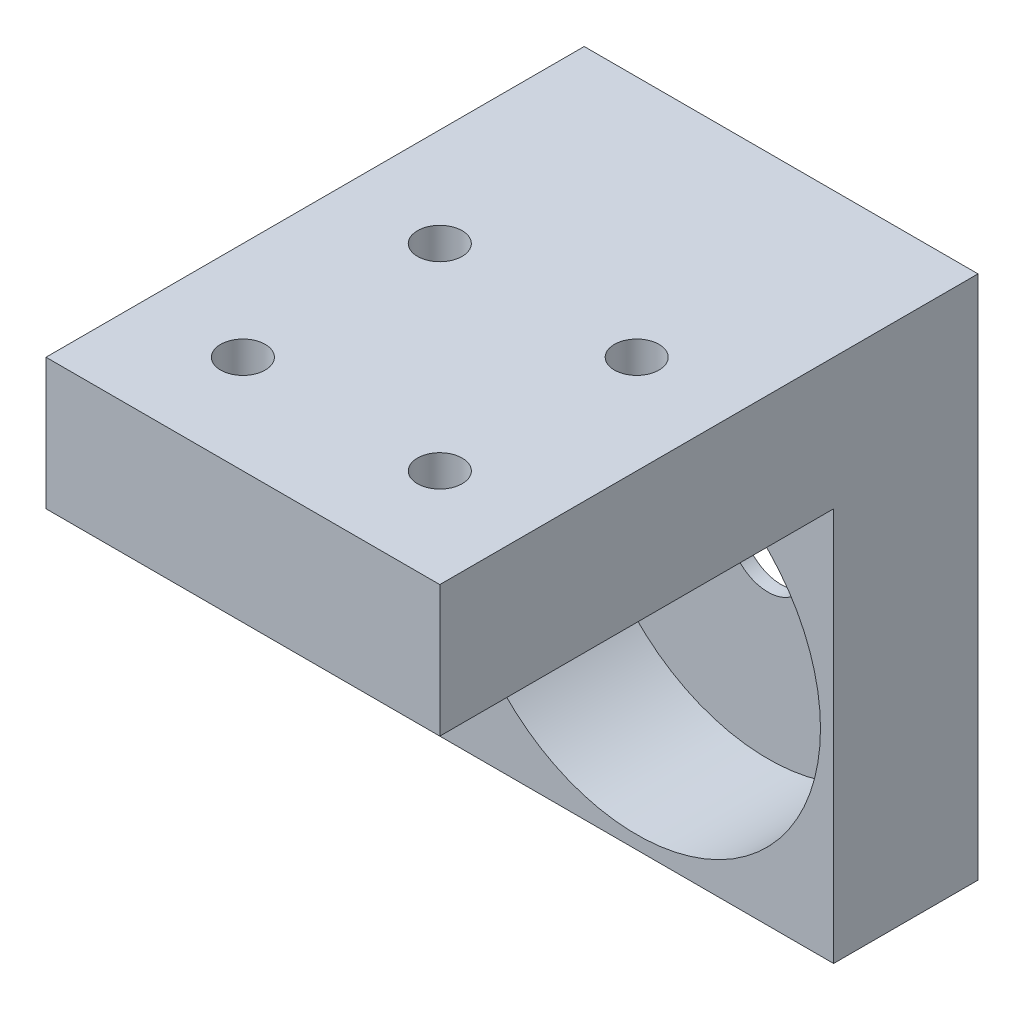
ISO-10303-21;
HEADER;
FILE_DESCRIPTION(('STEP AP214'),'2;1');
FILE_NAME('part.step','',(''),(''),'','','');
FILE_SCHEMA(('AUTOMOTIVE_DESIGN { 1 0 10303 214 1 1 1 1 }'));
ENDSEC;
DATA;
#1=APPLICATION_CONTEXT('core data for automotive mechanical design processes');
#2=APPLICATION_PROTOCOL_DEFINITION('international standard','automotive_design',2000,#1);
#3=PRODUCT_CONTEXT('',#1,'mechanical');
#4=PRODUCT('Part','Part','',(#3));
#5=PRODUCT_RELATED_PRODUCT_CATEGORY('part','',(#4));
#6=PRODUCT_DEFINITION_FORMATION('','',#4);
#7=PRODUCT_DEFINITION_CONTEXT('part definition',#1,'design');
#8=PRODUCT_DEFINITION('design','',#6,#7);
#9=PRODUCT_DEFINITION_SHAPE('','',#8);
#10=(LENGTH_UNIT() NAMED_UNIT(*) SI_UNIT(.MILLI.,.METRE.));
#11=(NAMED_UNIT(*) PLANE_ANGLE_UNIT() SI_UNIT($,.RADIAN.));
#12=(NAMED_UNIT(*) SI_UNIT($,.STERADIAN.) SOLID_ANGLE_UNIT());
#13=UNCERTAINTY_MEASURE_WITH_UNIT(LENGTH_MEASURE(1.E-05),#10,'distance_accuracy_value','');
#14=(GEOMETRIC_REPRESENTATION_CONTEXT(3) GLOBAL_UNCERTAINTY_ASSIGNED_CONTEXT((#13)) GLOBAL_UNIT_ASSIGNED_CONTEXT((#10,
#11,#12)) REPRESENTATION_CONTEXT('',''));
#15=CARTESIAN_POINT('',(0.,0.,0.));
#16=DIRECTION('',(0.,0.,1.));
#17=DIRECTION('',(1.,0.,0.));
#18=AXIS2_PLACEMENT_3D('',#15,#16,#17);
#19=CARTESIAN_POINT('',(0.,0.,11.));
#20=DIRECTION('',(1.,0.,0.));
#21=DIRECTION('',(0.,0.,-1.));
#22=AXIS2_PLACEMENT_3D('',#19,#20,#21);
#23=PLANE('',#22);
#24=DIRECTION('',(0.,-1.,0.));
#25=VECTOR('',#24,1.);
#26=CARTESIAN_POINT('',(0.,0.,0.));
#27=LINE('',#26,#25);
#28=CARTESIAN_POINT('',(0.,40.,0.));
#29=VERTEX_POINT('',#28);
#30=CARTESIAN_POINT('',(0.,0.,0.));
#31=VERTEX_POINT('',#30);
#32=EDGE_CURVE('E224',#29,#31,#27,.T.);
#33=ORIENTED_EDGE('',*,*,#32,.T.);
#34=DIRECTION('',(0.,0.,-1.));
#35=VECTOR('',#34,1.);
#36=CARTESIAN_POINT('',(0.,0.,11.));
#37=LINE('',#36,#35);
#38=CARTESIAN_POINT('',(0.,0.,11.));
#39=VERTEX_POINT('',#38);
#40=EDGE_CURVE('E14',#39,#31,#37,.T.);
#41=ORIENTED_EDGE('',*,*,#40,.F.);
#42=DIRECTION('',(0.,-1.,0.));
#43=VECTOR('',#42,1.);
#44=CARTESIAN_POINT('',(0.,0.,11.));
#45=LINE('',#44,#43);
#46=CARTESIAN_POINT('',(0.,30.,11.));
#47=VERTEX_POINT('',#46);
#48=EDGE_CURVE('E212',#47,#39,#45,.T.);
#49=ORIENTED_EDGE('',*,*,#48,.F.);
#50=DIRECTION('',(0.,0.,1.));
#51=VECTOR('',#50,1.);
#52=CARTESIAN_POINT('',(0.,30.,0.));
#53=LINE('',#52,#51);
#54=CARTESIAN_POINT('',(0.,30.,41.));
#55=VERTEX_POINT('',#54);
#56=EDGE_CURVE('E176',#47,#55,#53,.T.);
#57=ORIENTED_EDGE('',*,*,#56,.T.);
#58=DIRECTION('',(0.,-1.,0.));
#59=VECTOR('',#58,1.);
#60=CARTESIAN_POINT('',(0.,40.,41.));
#61=LINE('',#60,#59);
#62=CARTESIAN_POINT('',(0.,40.,41.));
#63=VERTEX_POINT('',#62);
#64=EDGE_CURVE('E257',#63,#55,#61,.T.);
#65=ORIENTED_EDGE('',*,*,#64,.F.);
#66=DIRECTION('',(0.,0.,1.));
#67=VECTOR('',#66,1.);
#68=CARTESIAN_POINT('',(0.,40.,0.));
#69=LINE('',#68,#67);
#70=EDGE_CURVE('E228',#29,#63,#69,.T.);
#71=ORIENTED_EDGE('',*,*,#70,.F.);
#72=EDGE_LOOP('',(#33,#41,#49,#57,#65,#71));
#73=FACE_BOUND('',#72,.T.);
#74=ADVANCED_FACE('F157',(#73),#23,.F.);
#75=CARTESIAN_POINT('',(0.,0.,11.));
#76=DIRECTION('',(0.,1.,0.));
#77=DIRECTION('',(0.,0.,1.));
#78=AXIS2_PLACEMENT_3D('',#75,#76,#77);
#79=PLANE('',#78);
#80=DIRECTION('',(1.,0.,0.));
#81=VECTOR('',#80,1.);
#82=CARTESIAN_POINT('',(0.,0.,0.));
#83=LINE('',#82,#81);
#84=CARTESIAN_POINT('',(30.,0.,0.));
#85=VERTEX_POINT('',#84);
#86=EDGE_CURVE('E190',#31,#85,#83,.T.);
#87=ORIENTED_EDGE('',*,*,#86,.T.);
#88=DIRECTION('',(0.,0.,-1.));
#89=VECTOR('',#88,1.);
#90=CARTESIAN_POINT('',(30.,0.,11.));
#91=LINE('',#90,#89);
#92=CARTESIAN_POINT('',(30.,0.,11.));
#93=VERTEX_POINT('',#92);
#94=EDGE_CURVE('E169',#93,#85,#91,.T.);
#95=ORIENTED_EDGE('',*,*,#94,.F.);
#96=DIRECTION('',(1.,0.,0.));
#97=VECTOR('',#96,1.);
#98=CARTESIAN_POINT('',(0.,0.,11.));
#99=LINE('',#98,#97);
#100=EDGE_CURVE('E201',#39,#93,#99,.T.);
#101=ORIENTED_EDGE('',*,*,#100,.F.);
#102=ORIENTED_EDGE('',*,*,#40,.T.);
#103=EDGE_LOOP('',(#87,#95,#101,#102));
#104=FACE_BOUND('',#103,.T.);
#105=ADVANCED_FACE('F202',(#104),#79,.F.);
#106=CARTESIAN_POINT('',(30.,0.,11.));
#107=DIRECTION('',(-1.,0.,0.));
#108=DIRECTION('',(0.,0.,1.));
#109=AXIS2_PLACEMENT_3D('',#106,#107,#108);
#110=PLANE('',#109);
#111=DIRECTION('',(0.,1.,0.));
#112=VECTOR('',#111,1.);
#113=CARTESIAN_POINT('',(30.,0.,0.));
#114=LINE('',#113,#112);
#115=CARTESIAN_POINT('',(30.,40.,0.));
#116=VERTEX_POINT('',#115);
#117=EDGE_CURVE('E219',#85,#116,#114,.T.);
#118=ORIENTED_EDGE('',*,*,#117,.T.);
#119=DIRECTION('',(0.,0.,-1.));
#120=VECTOR('',#119,1.);
#121=CARTESIAN_POINT('',(30.,40.,0.));
#122=LINE('',#121,#120);
#123=CARTESIAN_POINT('',(30.,40.,41.));
#124=VERTEX_POINT('',#123);
#125=EDGE_CURVE('E285',#124,#116,#122,.T.);
#126=ORIENTED_EDGE('',*,*,#125,.F.);
#127=DIRECTION('',(0.,-1.,0.));
#128=VECTOR('',#127,1.);
#129=CARTESIAN_POINT('',(30.,40.,41.));
#130=LINE('',#129,#128);
#131=CARTESIAN_POINT('',(30.,30.,41.));
#132=VERTEX_POINT('',#131);
#133=EDGE_CURVE('E270',#124,#132,#130,.T.);
#134=ORIENTED_EDGE('',*,*,#133,.T.);
#135=DIRECTION('',(0.,0.,-1.));
#136=VECTOR('',#135,1.);
#137=CARTESIAN_POINT('',(30.,30.,0.));
#138=LINE('',#137,#136);
#139=CARTESIAN_POINT('',(30.,30.,11.));
#140=VERTEX_POINT('',#139);
#141=EDGE_CURVE('E275',#132,#140,#138,.T.);
#142=ORIENTED_EDGE('',*,*,#141,.T.);
#143=DIRECTION('',(0.,1.,0.));
#144=VECTOR('',#143,1.);
#145=CARTESIAN_POINT('',(30.,0.,11.));
#146=LINE('',#145,#144);
#147=EDGE_CURVE('E213',#93,#140,#146,.T.);
#148=ORIENTED_EDGE('',*,*,#147,.F.);
#149=ORIENTED_EDGE('',*,*,#94,.T.);
#150=EDGE_LOOP('',(#118,#126,#134,#142,#148,#149));
#151=FACE_BOUND('',#150,.T.);
#152=ADVANCED_FACE('F356',(#151),#110,.F.);
#153=CARTESIAN_POINT('',(0.,0.,11.));
#154=DIRECTION('',(0.,0.,-1.));
#155=DIRECTION('',(-1.,0.,0.));
#156=AXIS2_PLACEMENT_3D('',#153,#154,#155);
#157=PLANE('',#156);
#158=CARTESIAN_POINT('',(15.,15.,11.));
#159=DIRECTION('',(0.,0.,1.));
#160=DIRECTION('',(1.,0.,0.));
#161=AXIS2_PLACEMENT_3D('',#158,#159,#160);
#162=CIRCLE('',#161,14.);
#163=CARTESIAN_POINT('',(29.,15.,11.));
#164=VERTEX_POINT('',#163);
#165=EDGE_CURVE('E240',#164,#164,#162,.T.);
#166=ORIENTED_EDGE('',*,*,#165,.F.);
#167=EDGE_LOOP('',(#166));
#168=FACE_BOUND('',#167,.T.);
#169=ORIENTED_EDGE('',*,*,#48,.T.);
#170=ORIENTED_EDGE('',*,*,#100,.T.);
#171=ORIENTED_EDGE('',*,*,#147,.T.);
#172=DIRECTION('',(-1.,0.,0.));
#173=VECTOR('',#172,1.);
#174=CARTESIAN_POINT('',(0.,30.,11.));
#175=LINE('',#174,#173);
#176=EDGE_CURVE('E192',#140,#47,#175,.T.);
#177=ORIENTED_EDGE('',*,*,#176,.T.);
#178=EDGE_LOOP('',(#169,#170,#171,#177));
#179=FACE_BOUND('',#178,.T.);
#180=ADVANCED_FACE('F220',(#168,#179),#157,.F.);
#181=CARTESIAN_POINT('',(0.,0.,0.));
#182=DIRECTION('',(0.,0.,-1.));
#183=DIRECTION('',(-1.,0.,0.));
#184=AXIS2_PLACEMENT_3D('',#181,#182,#183);
#185=PLANE('',#184);
#186=CARTESIAN_POINT('',(15.,15.,0.));
#187=DIRECTION('',(0.,0.,1.));
#188=DIRECTION('',(1.,0.,0.));
#189=AXIS2_PLACEMENT_3D('',#186,#187,#188);
#190=CIRCLE('',#189,2.99999999999999);
#191=CARTESIAN_POINT('',(18.,15.,0.));
#192=VERTEX_POINT('',#191);
#193=EDGE_CURVE('E255',#192,#192,#190,.T.);
#194=ORIENTED_EDGE('',*,*,#193,.T.);
#195=EDGE_LOOP('',(#194));
#196=FACE_BOUND('',#195,.T.);
#197=ORIENTED_EDGE('',*,*,#32,.F.);
#198=DIRECTION('',(-1.,0.,0.));
#199=VECTOR('',#198,1.);
#200=CARTESIAN_POINT('',(0.,40.,0.));
#201=LINE('',#200,#199);
#202=EDGE_CURVE('E271',#116,#29,#201,.T.);
#203=ORIENTED_EDGE('',*,*,#202,.F.);
#204=ORIENTED_EDGE('',*,*,#117,.F.);
#205=ORIENTED_EDGE('',*,*,#86,.F.);
#206=EDGE_LOOP('',(#197,#203,#204,#205));
#207=FACE_BOUND('',#206,.T.);
#208=ADVANCED_FACE('F362',(#196,#207),#185,.T.);
#209=CARTESIAN_POINT('',(15.,15.,0.999999999999999));
#210=DIRECTION('',(0.,0.,1.));
#211=DIRECTION('',(1.,0.,0.));
#212=AXIS2_PLACEMENT_3D('',#209,#210,#211);
#213=CYLINDRICAL_SURFACE('',#212,14.);
#214=CARTESIAN_POINT('',(15.,15.,0.999999999999999));
#215=DIRECTION('',(0.,0.,1.));
#216=DIRECTION('',(1.,0.,0.));
#217=AXIS2_PLACEMENT_3D('',#214,#215,#216);
#218=CIRCLE('',#217,14.);
#219=CARTESIAN_POINT('',(29.,15.,0.999999999999999));
#220=VERTEX_POINT('',#219);
#221=EDGE_CURVE('E226',#220,#220,#218,.T.);
#222=ORIENTED_EDGE('',*,*,#221,.F.);
#223=EDGE_LOOP('',(#222));
#224=FACE_BOUND('',#223,.T.);
#225=ORIENTED_EDGE('',*,*,#165,.T.);
#226=EDGE_LOOP('',(#225));
#227=FACE_BOUND('',#226,.T.);
#228=ADVANCED_FACE('F364',(#224,#227),#213,.F.);
#229=CARTESIAN_POINT('',(15.,15.,0.999999999999999));
#230=DIRECTION('',(0.,0.,1.));
#231=DIRECTION('',(1.,0.,0.));
#232=AXIS2_PLACEMENT_3D('',#229,#230,#231);
#233=PLANE('',#232);
#234=CARTESIAN_POINT('',(15.,15.,0.999999999999999));
#235=DIRECTION('',(0.,0.,1.));
#236=DIRECTION('',(1.,0.,0.));
#237=AXIS2_PLACEMENT_3D('',#234,#235,#236);
#238=CIRCLE('',#237,2.99999999999999);
#239=CARTESIAN_POINT('',(18.,15.,0.999999999999999));
#240=VERTEX_POINT('',#239);
#241=EDGE_CURVE('E258',#240,#240,#238,.T.);
#242=ORIENTED_EDGE('',*,*,#241,.F.);
#243=EDGE_LOOP('',(#242));
#244=FACE_BOUND('',#243,.T.);
#245=ORIENTED_EDGE('',*,*,#221,.T.);
#246=EDGE_LOOP('',(#245));
#247=FACE_BOUND('',#246,.T.);
#248=ADVANCED_FACE('F371',(#244,#247),#233,.T.);
#249=CARTESIAN_POINT('',(15.,15.,0.));
#250=DIRECTION('',(0.,0.,1.));
#251=DIRECTION('',(1.,0.,0.));
#252=AXIS2_PLACEMENT_3D('',#249,#250,#251);
#253=CYLINDRICAL_SURFACE('',#252,2.99999999999999);
#254=ORIENTED_EDGE('',*,*,#193,.F.);
#255=EDGE_LOOP('',(#254));
#256=FACE_BOUND('',#255,.T.);
#257=ORIENTED_EDGE('',*,*,#241,.T.);
#258=EDGE_LOOP('',(#257));
#259=FACE_BOUND('',#258,.T.);
#260=ADVANCED_FACE('F374',(#256,#259),#253,.F.);
#261=CARTESIAN_POINT('',(0.,40.,41.));
#262=DIRECTION('',(0.,0.,-1.));
#263=DIRECTION('',(-1.,0.,0.));
#264=AXIS2_PLACEMENT_3D('',#261,#262,#263);
#265=PLANE('',#264);
#266=DIRECTION('',(1.,0.,0.));
#267=VECTOR('',#266,1.);
#268=CARTESIAN_POINT('',(0.,30.,41.));
#269=LINE('',#268,#267);
#270=EDGE_CURVE('E274',#55,#132,#269,.T.);
#271=ORIENTED_EDGE('',*,*,#270,.T.);
#272=ORIENTED_EDGE('',*,*,#133,.F.);
#273=DIRECTION('',(1.,0.,0.));
#274=VECTOR('',#273,1.);
#275=CARTESIAN_POINT('',(0.,40.,41.));
#276=LINE('',#275,#274);
#277=EDGE_CURVE('E287',#63,#124,#276,.T.);
#278=ORIENTED_EDGE('',*,*,#277,.F.);
#279=ORIENTED_EDGE('',*,*,#64,.T.);
#280=EDGE_LOOP('',(#271,#272,#278,#279));
#281=FACE_BOUND('',#280,.T.);
#282=ADVANCED_FACE('F378',(#281),#265,.F.);
#283=CARTESIAN_POINT('',(0.,40.,0.));
#284=DIRECTION('',(0.,1.,0.));
#285=DIRECTION('',(0.,0.,1.));
#286=AXIS2_PLACEMENT_3D('',#283,#284,#285);
#287=PLANE('',#286);
#288=CARTESIAN_POINT('',(22.5,40.,33.5));
#289=DIRECTION('',(0.,-1.,0.));
#290=DIRECTION('',(0.,0.,-1.));
#291=AXIS2_PLACEMENT_3D('',#288,#289,#290);
#292=CIRCLE('',#291,1.7);
#293=CARTESIAN_POINT('',(22.5,40.,31.8));
#294=VERTEX_POINT('',#293);
#295=EDGE_CURVE('E313',#294,#294,#292,.T.);
#296=ORIENTED_EDGE('',*,*,#295,.T.);
#297=EDGE_LOOP('',(#296));
#298=FACE_BOUND('',#297,.T.);
#299=CARTESIAN_POINT('',(7.5,40.,18.5));
#300=DIRECTION('',(0.,-1.,0.));
#301=DIRECTION('',(0.,0.,-1.));
#302=AXIS2_PLACEMENT_3D('',#299,#300,#301);
#303=CIRCLE('',#302,1.7);
#304=CARTESIAN_POINT('',(7.5,40.,16.8));
#305=VERTEX_POINT('',#304);
#306=EDGE_CURVE('E305',#305,#305,#303,.T.);
#307=ORIENTED_EDGE('',*,*,#306,.T.);
#308=EDGE_LOOP('',(#307));
#309=FACE_BOUND('',#308,.T.);
#310=CARTESIAN_POINT('',(22.5,40.,18.5));
#311=DIRECTION('',(0.,-1.,0.));
#312=DIRECTION('',(0.,0.,-1.));
#313=AXIS2_PLACEMENT_3D('',#310,#311,#312);
#314=CIRCLE('',#313,1.7);
#315=CARTESIAN_POINT('',(22.5,40.,16.8));
#316=VERTEX_POINT('',#315);
#317=EDGE_CURVE('E318',#316,#316,#314,.T.);
#318=ORIENTED_EDGE('',*,*,#317,.T.);
#319=EDGE_LOOP('',(#318));
#320=FACE_BOUND('',#319,.T.);
#321=CARTESIAN_POINT('',(7.5,40.,33.5));
#322=DIRECTION('',(0.,-1.,0.));
#323=DIRECTION('',(0.,0.,-1.));
#324=AXIS2_PLACEMENT_3D('',#321,#322,#323);
#325=CIRCLE('',#324,1.7);
#326=CARTESIAN_POINT('',(7.5,40.,31.8));
#327=VERTEX_POINT('',#326);
#328=EDGE_CURVE('E283',#327,#327,#325,.T.);
#329=ORIENTED_EDGE('',*,*,#328,.T.);
#330=EDGE_LOOP('',(#329));
#331=FACE_BOUND('',#330,.T.);
#332=ORIENTED_EDGE('',*,*,#70,.T.);
#333=ORIENTED_EDGE('',*,*,#277,.T.);
#334=ORIENTED_EDGE('',*,*,#125,.T.);
#335=ORIENTED_EDGE('',*,*,#202,.T.);
#336=EDGE_LOOP('',(#332,#333,#334,#335));
#337=FACE_BOUND('',#336,.T.);
#338=ADVANCED_FACE('F334',(#298,#309,#320,#331,#337),#287,.T.);
#339=CARTESIAN_POINT('',(0.,30.,0.));
#340=DIRECTION('',(0.,1.,0.));
#341=DIRECTION('',(0.,0.,1.));
#342=AXIS2_PLACEMENT_3D('',#339,#340,#341);
#343=PLANE('',#342);
#344=CARTESIAN_POINT('',(22.5,30.,33.5));
#345=DIRECTION('',(0.,-1.,0.));
#346=DIRECTION('',(0.,0.,-1.));
#347=AXIS2_PLACEMENT_3D('',#344,#345,#346);
#348=CIRCLE('',#347,1.7);
#349=CARTESIAN_POINT('',(22.5,30.,31.8));
#350=VERTEX_POINT('',#349);
#351=EDGE_CURVE('E297',#350,#350,#348,.T.);
#352=ORIENTED_EDGE('',*,*,#351,.F.);
#353=EDGE_LOOP('',(#352));
#354=FACE_BOUND('',#353,.T.);
#355=CARTESIAN_POINT('',(7.5,30.,18.5));
#356=DIRECTION('',(0.,-1.,0.));
#357=DIRECTION('',(0.,0.,-1.));
#358=AXIS2_PLACEMENT_3D('',#355,#356,#357);
#359=CIRCLE('',#358,1.7);
#360=CARTESIAN_POINT('',(7.5,30.,16.8));
#361=VERTEX_POINT('',#360);
#362=EDGE_CURVE('E308',#361,#361,#359,.T.);
#363=ORIENTED_EDGE('',*,*,#362,.F.);
#364=EDGE_LOOP('',(#363));
#365=FACE_BOUND('',#364,.T.);
#366=CARTESIAN_POINT('',(22.5,30.,18.5));
#367=DIRECTION('',(0.,-1.,0.));
#368=DIRECTION('',(0.,0.,-1.));
#369=AXIS2_PLACEMENT_3D('',#366,#367,#368);
#370=CIRCLE('',#369,1.7);
#371=CARTESIAN_POINT('',(22.5,30.,16.8));
#372=VERTEX_POINT('',#371);
#373=EDGE_CURVE('E307',#372,#372,#370,.T.);
#374=ORIENTED_EDGE('',*,*,#373,.F.);
#375=EDGE_LOOP('',(#374));
#376=FACE_BOUND('',#375,.T.);
#377=CARTESIAN_POINT('',(7.5,30.,33.5));
#378=DIRECTION('',(0.,-1.,0.));
#379=DIRECTION('',(0.,0.,-1.));
#380=AXIS2_PLACEMENT_3D('',#377,#378,#379);
#381=CIRCLE('',#380,1.7);
#382=CARTESIAN_POINT('',(7.5,30.,31.8));
#383=VERTEX_POINT('',#382);
#384=EDGE_CURVE('E294',#383,#383,#381,.T.);
#385=ORIENTED_EDGE('',*,*,#384,.F.);
#386=EDGE_LOOP('',(#385));
#387=FACE_BOUND('',#386,.T.);
#388=ORIENTED_EDGE('',*,*,#176,.F.);
#389=ORIENTED_EDGE('',*,*,#141,.F.);
#390=ORIENTED_EDGE('',*,*,#270,.F.);
#391=ORIENTED_EDGE('',*,*,#56,.F.);
#392=EDGE_LOOP('',(#388,#389,#390,#391));
#393=FACE_BOUND('',#392,.T.);
#394=ADVANCED_FACE('F328',(#354,#365,#376,#387,#393),#343,.F.);
#395=CARTESIAN_POINT('',(7.5,40.,33.5));
#396=DIRECTION('',(0.,-1.,0.));
#397=DIRECTION('',(0.,0.,-1.));
#398=AXIS2_PLACEMENT_3D('',#395,#396,#397);
#399=CYLINDRICAL_SURFACE('',#398,1.7);
#400=ORIENTED_EDGE('',*,*,#328,.F.);
#401=EDGE_LOOP('',(#400));
#402=FACE_BOUND('',#401,.T.);
#403=ORIENTED_EDGE('',*,*,#384,.T.);
#404=EDGE_LOOP('',(#403));
#405=FACE_BOUND('',#404,.T.);
#406=ADVANCED_FACE('F335',(#402,#405),#399,.F.);
#407=CARTESIAN_POINT('',(22.5,40.,18.5));
#408=DIRECTION('',(0.,-1.,0.));
#409=DIRECTION('',(0.,0.,-1.));
#410=AXIS2_PLACEMENT_3D('',#407,#408,#409);
#411=CYLINDRICAL_SURFACE('',#410,1.7);
#412=ORIENTED_EDGE('',*,*,#317,.F.);
#413=EDGE_LOOP('',(#412));
#414=FACE_BOUND('',#413,.T.);
#415=ORIENTED_EDGE('',*,*,#373,.T.);
#416=EDGE_LOOP('',(#415));
#417=FACE_BOUND('',#416,.T.);
#418=ADVANCED_FACE('F330',(#414,#417),#411,.F.);
#419=CARTESIAN_POINT('',(7.5,40.,18.5));
#420=DIRECTION('',(0.,-1.,0.));
#421=DIRECTION('',(0.,0.,-1.));
#422=AXIS2_PLACEMENT_3D('',#419,#420,#421);
#423=CYLINDRICAL_SURFACE('',#422,1.7);
#424=ORIENTED_EDGE('',*,*,#306,.F.);
#425=EDGE_LOOP('',(#424));
#426=FACE_BOUND('',#425,.T.);
#427=ORIENTED_EDGE('',*,*,#362,.T.);
#428=EDGE_LOOP('',(#427));
#429=FACE_BOUND('',#428,.T.);
#430=ADVANCED_FACE('F343',(#426,#429),#423,.F.);
#431=CARTESIAN_POINT('',(22.5,40.,33.5));
#432=DIRECTION('',(0.,-1.,0.));
#433=DIRECTION('',(0.,0.,-1.));
#434=AXIS2_PLACEMENT_3D('',#431,#432,#433);
#435=CYLINDRICAL_SURFACE('',#434,1.7);
#436=ORIENTED_EDGE('',*,*,#295,.F.);
#437=EDGE_LOOP('',(#436));
#438=FACE_BOUND('',#437,.T.);
#439=ORIENTED_EDGE('',*,*,#351,.T.);
#440=EDGE_LOOP('',(#439));
#441=FACE_BOUND('',#440,.T.);
#442=ADVANCED_FACE('F403',(#438,#441),#435,.F.);
#443=CLOSED_SHELL('',(#74,#105,#152,#180,#208,#228,#248,#260,#282,#338,#394,#406,#418,#430,#442));
#444=MANIFOLD_SOLID_BREP('B2',#443);
#445=ADVANCED_BREP_SHAPE_REPRESENTATION('',(#18,#444),#14);
#446=SHAPE_DEFINITION_REPRESENTATION(#9,#445);
ENDSEC;
END-ISO-10303-21;
